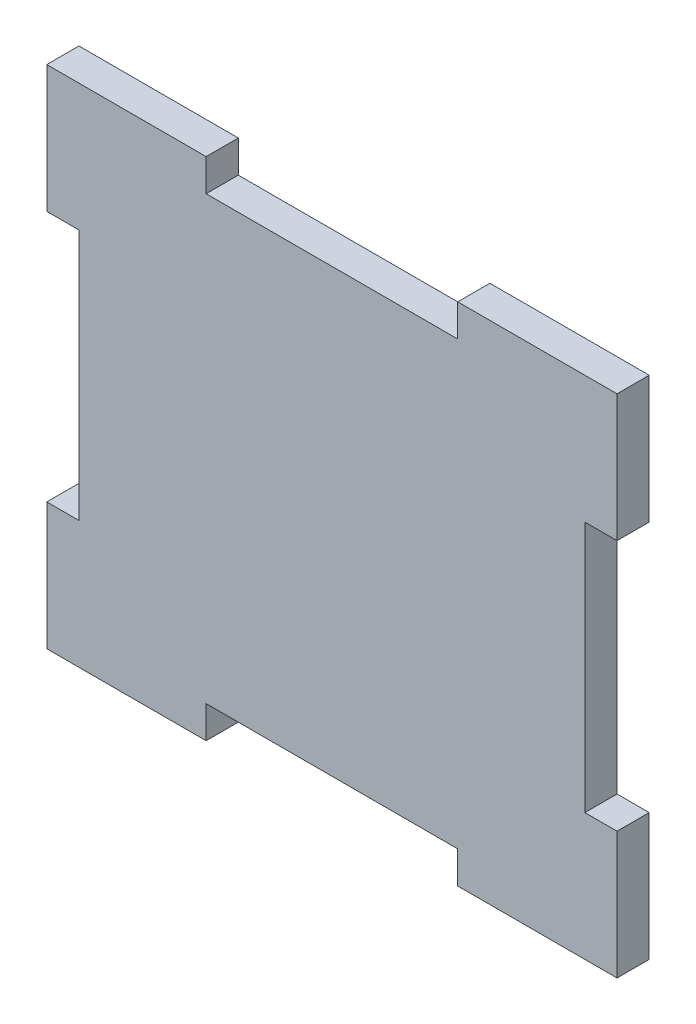
ISO-10303-21;
HEADER;
FILE_DESCRIPTION(('STEP AP214'),'2;1');
FILE_NAME('part.step','',(''),(''),'','','');
FILE_SCHEMA(('AUTOMOTIVE_DESIGN { 1 0 10303 214 1 1 1 1 }'));
ENDSEC;
DATA;
#1=APPLICATION_CONTEXT('core data for automotive mechanical design processes');
#2=APPLICATION_PROTOCOL_DEFINITION('international standard','automotive_design',2000,#1);
#3=PRODUCT_CONTEXT('',#1,'mechanical');
#4=PRODUCT('Part','Part','',(#3));
#5=PRODUCT_RELATED_PRODUCT_CATEGORY('part','',(#4));
#6=PRODUCT_DEFINITION_FORMATION('','',#4);
#7=PRODUCT_DEFINITION_CONTEXT('part definition',#1,'design');
#8=PRODUCT_DEFINITION('design','',#6,#7);
#9=PRODUCT_DEFINITION_SHAPE('','',#8);
#10=(LENGTH_UNIT() NAMED_UNIT(*) SI_UNIT(.MILLI.,.METRE.));
#11=(NAMED_UNIT(*) PLANE_ANGLE_UNIT() SI_UNIT($,.RADIAN.));
#12=(NAMED_UNIT(*) SI_UNIT($,.STERADIAN.) SOLID_ANGLE_UNIT());
#13=UNCERTAINTY_MEASURE_WITH_UNIT(LENGTH_MEASURE(1.E-05),#10,'distance_accuracy_value','');
#14=(GEOMETRIC_REPRESENTATION_CONTEXT(3) GLOBAL_UNCERTAINTY_ASSIGNED_CONTEXT((#13)) GLOBAL_UNIT_ASSIGNED_CONTEXT((#10,
#11,#12)) REPRESENTATION_CONTEXT('',''));
#15=CARTESIAN_POINT('',(0.,0.,0.));
#16=DIRECTION('',(0.,0.,1.));
#17=DIRECTION('',(1.,0.,0.));
#18=AXIS2_PLACEMENT_3D('',#15,#16,#17);
#19=CARTESIAN_POINT('',(0.,0.,6.36));
#20=DIRECTION('',(0.,0.,1.));
#21=DIRECTION('',(1.,0.,0.));
#22=AXIS2_PLACEMENT_3D('',#19,#20,#21);
#23=PLANE('',#22);
#24=DIRECTION('',(0.,-1.,0.));
#25=VECTOR('',#24,1.);
#26=CARTESIAN_POINT('',(-56.36,50.,6.36));
#27=LINE('',#26,#25);
#28=CARTESIAN_POINT('',(-56.36,50.,6.36));
#29=VERTEX_POINT('',#28);
#30=CARTESIAN_POINT('',(-56.36,24.865,6.36));
#31=VERTEX_POINT('',#30);
#32=EDGE_CURVE('E296',#29,#31,#27,.T.);
#33=ORIENTED_EDGE('',*,*,#32,.T.);
#34=DIRECTION('',(1.,0.,0.));
#35=VECTOR('',#34,1.);
#36=CARTESIAN_POINT('',(-56.36,24.865,6.36));
#37=LINE('',#36,#35);
#38=CARTESIAN_POINT('',(-50.,24.865,6.36));
#39=VERTEX_POINT('',#38);
#40=EDGE_CURVE('E196',#31,#39,#37,.T.);
#41=ORIENTED_EDGE('',*,*,#40,.T.);
#42=DIRECTION('',(0.,-1.,0.));
#43=VECTOR('',#42,1.);
#44=CARTESIAN_POINT('',(-50.,24.865,6.36));
#45=LINE('',#44,#43);
#46=CARTESIAN_POINT('',(-50.,-24.865,6.36));
#47=VERTEX_POINT('',#46);
#48=EDGE_CURVE('E199',#39,#47,#45,.T.);
#49=ORIENTED_EDGE('',*,*,#48,.T.);
#50=DIRECTION('',(-1.,0.,0.));
#51=VECTOR('',#50,1.);
#52=CARTESIAN_POINT('',(-56.36,-24.865,6.36));
#53=LINE('',#52,#51);
#54=CARTESIAN_POINT('',(-56.36,-24.865,6.36));
#55=VERTEX_POINT('',#54);
#56=EDGE_CURVE('E188',#47,#55,#53,.T.);
#57=ORIENTED_EDGE('',*,*,#56,.T.);
#58=CARTESIAN_POINT('',(-56.36,-50.,6.36));
#59=VERTEX_POINT('',#58);
#60=EDGE_CURVE('E295',#55,#59,#27,.T.);
#61=ORIENTED_EDGE('',*,*,#60,.T.);
#62=DIRECTION('',(1.,0.,0.));
#63=VECTOR('',#62,1.);
#64=CARTESIAN_POINT('',(-56.36,-50.,6.36));
#65=LINE('',#64,#63);
#66=CARTESIAN_POINT('',(-24.865,-50.,6.36));
#67=VERTEX_POINT('',#66);
#68=EDGE_CURVE('E300',#59,#67,#65,.T.);
#69=ORIENTED_EDGE('',*,*,#68,.T.);
#70=DIRECTION('',(0.,1.,0.));
#71=VECTOR('',#70,1.);
#72=CARTESIAN_POINT('',(-24.865,-50.,6.36));
#73=LINE('',#72,#71);
#74=CARTESIAN_POINT('',(-24.865,-43.64,6.36));
#75=VERTEX_POINT('',#74);
#76=EDGE_CURVE('E229',#67,#75,#73,.T.);
#77=ORIENTED_EDGE('',*,*,#76,.T.);
#78=DIRECTION('',(1.,0.,0.));
#79=VECTOR('',#78,1.);
#80=CARTESIAN_POINT('',(-24.865,-43.64,6.36));
#81=LINE('',#80,#79);
#82=CARTESIAN_POINT('',(24.865,-43.64,6.36));
#83=VERTEX_POINT('',#82);
#84=EDGE_CURVE('E238',#75,#83,#81,.T.);
#85=ORIENTED_EDGE('',*,*,#84,.T.);
#86=DIRECTION('',(0.,-1.,0.));
#87=VECTOR('',#86,1.);
#88=CARTESIAN_POINT('',(24.865,-50.,6.36));
#89=LINE('',#88,#87);
#90=CARTESIAN_POINT('',(24.865,-50.,6.36));
#91=VERTEX_POINT('',#90);
#92=EDGE_CURVE('E246',#83,#91,#89,.T.);
#93=ORIENTED_EDGE('',*,*,#92,.T.);
#94=CARTESIAN_POINT('',(56.36,-50.,6.36));
#95=VERTEX_POINT('',#94);
#96=EDGE_CURVE('E299',#91,#95,#65,.T.);
#97=ORIENTED_EDGE('',*,*,#96,.T.);
#98=DIRECTION('',(0.,1.,0.));
#99=VECTOR('',#98,1.);
#100=CARTESIAN_POINT('',(56.36,50.,6.36));
#101=LINE('',#100,#99);
#102=CARTESIAN_POINT('',(56.36,-24.865,6.36));
#103=VERTEX_POINT('',#102);
#104=EDGE_CURVE('E287',#95,#103,#101,.T.);
#105=ORIENTED_EDGE('',*,*,#104,.T.);
#106=DIRECTION('',(1.,0.,0.));
#107=VECTOR('',#106,1.);
#108=CARTESIAN_POINT('',(56.36,-24.865,6.36));
#109=LINE('',#108,#107);
#110=CARTESIAN_POINT('',(50.,-24.865,6.36));
#111=VERTEX_POINT('',#110);
#112=EDGE_CURVE('E213',#111,#103,#109,.T.);
#113=ORIENTED_EDGE('',*,*,#112,.F.);
#114=DIRECTION('',(0.,-1.,0.));
#115=VECTOR('',#114,1.);
#116=CARTESIAN_POINT('',(50.,24.865,6.36));
#117=LINE('',#116,#115);
#118=CARTESIAN_POINT('',(50.,24.865,6.36));
#119=VERTEX_POINT('',#118);
#120=EDGE_CURVE('E222',#119,#111,#117,.T.);
#121=ORIENTED_EDGE('',*,*,#120,.F.);
#122=DIRECTION('',(-1.,0.,0.));
#123=VECTOR('',#122,1.);
#124=CARTESIAN_POINT('',(56.36,24.865,6.36));
#125=LINE('',#124,#123);
#126=CARTESIAN_POINT('',(56.36,24.865,6.36));
#127=VERTEX_POINT('',#126);
#128=EDGE_CURVE('E208',#127,#119,#125,.T.);
#129=ORIENTED_EDGE('',*,*,#128,.F.);
#130=CARTESIAN_POINT('',(56.36,50.,6.36));
#131=VERTEX_POINT('',#130);
#132=EDGE_CURVE('E291',#127,#131,#101,.T.);
#133=ORIENTED_EDGE('',*,*,#132,.T.);
#134=DIRECTION('',(-1.,0.,0.));
#135=VECTOR('',#134,1.);
#136=CARTESIAN_POINT('',(-56.36,50.,6.36));
#137=LINE('',#136,#135);
#138=CARTESIAN_POINT('',(24.865,50.,6.36));
#139=VERTEX_POINT('',#138);
#140=EDGE_CURVE('E292',#131,#139,#137,.T.);
#141=ORIENTED_EDGE('',*,*,#140,.T.);
#142=DIRECTION('',(0.,1.,0.));
#143=VECTOR('',#142,1.);
#144=CARTESIAN_POINT('',(24.865,50.,6.36));
#145=LINE('',#144,#143);
#146=CARTESIAN_POINT('',(24.865,43.64,6.36));
#147=VERTEX_POINT('',#146);
#148=EDGE_CURVE('E265',#147,#139,#145,.T.);
#149=ORIENTED_EDGE('',*,*,#148,.F.);
#150=DIRECTION('',(1.,0.,0.));
#151=VECTOR('',#150,1.);
#152=CARTESIAN_POINT('',(-24.865,43.64,6.36));
#153=LINE('',#152,#151);
#154=CARTESIAN_POINT('',(-24.865,43.64,6.36));
#155=VERTEX_POINT('',#154);
#156=EDGE_CURVE('E274',#155,#147,#153,.T.);
#157=ORIENTED_EDGE('',*,*,#156,.F.);
#158=DIRECTION('',(0.,-1.,0.));
#159=VECTOR('',#158,1.);
#160=CARTESIAN_POINT('',(-24.865,50.,6.36));
#161=LINE('',#160,#159);
#162=CARTESIAN_POINT('',(-24.865,50.,6.36));
#163=VERTEX_POINT('',#162);
#164=EDGE_CURVE('E254',#163,#155,#161,.T.);
#165=ORIENTED_EDGE('',*,*,#164,.F.);
#166=EDGE_CURVE('E290',#163,#29,#137,.T.);
#167=ORIENTED_EDGE('',*,*,#166,.T.);
#168=EDGE_LOOP('',(#33,#41,#49,#57,#61,#69,#77,#85,#93,#97,#105,#113,#121,#129,#133,#141,#149,
#157,#165,#167));
#169=FACE_BOUND('',#168,.T.);
#170=ADVANCED_FACE('F38',(#169),#23,.T.);
#171=CARTESIAN_POINT('',(0.,0.,0.));
#172=DIRECTION('',(0.,0.,1.));
#173=DIRECTION('',(1.,0.,0.));
#174=AXIS2_PLACEMENT_3D('',#171,#172,#173);
#175=PLANE('',#174);
#176=DIRECTION('',(1.,0.,0.));
#177=VECTOR('',#176,1.);
#178=CARTESIAN_POINT('',(-56.36,24.865,0.));
#179=LINE('',#178,#177);
#180=CARTESIAN_POINT('',(-56.36,24.865,0.));
#181=VERTEX_POINT('',#180);
#182=CARTESIAN_POINT('',(-50.,24.865,0.));
#183=VERTEX_POINT('',#182);
#184=EDGE_CURVE('E184',#181,#183,#179,.T.);
#185=ORIENTED_EDGE('',*,*,#184,.F.);
#186=DIRECTION('',(0.,-1.,0.));
#187=VECTOR('',#186,1.);
#188=CARTESIAN_POINT('',(-56.36,50.,0.));
#189=LINE('',#188,#187);
#190=CARTESIAN_POINT('',(-56.36,50.,0.));
#191=VERTEX_POINT('',#190);
#192=EDGE_CURVE('E311',#191,#181,#189,.T.);
#193=ORIENTED_EDGE('',*,*,#192,.F.);
#194=DIRECTION('',(-1.,0.,0.));
#195=VECTOR('',#194,1.);
#196=CARTESIAN_POINT('',(-56.36,50.,0.));
#197=LINE('',#196,#195);
#198=CARTESIAN_POINT('',(-24.865,50.,0.));
#199=VERTEX_POINT('',#198);
#200=EDGE_CURVE('E307',#199,#191,#197,.T.);
#201=ORIENTED_EDGE('',*,*,#200,.F.);
#202=DIRECTION('',(0.,-1.,0.));
#203=VECTOR('',#202,1.);
#204=CARTESIAN_POINT('',(-24.865,50.,0.));
#205=LINE('',#204,#203);
#206=CARTESIAN_POINT('',(-24.865,43.64,0.));
#207=VERTEX_POINT('',#206);
#208=EDGE_CURVE('E261',#199,#207,#205,.T.);
#209=ORIENTED_EDGE('',*,*,#208,.T.);
#210=DIRECTION('',(1.,0.,0.));
#211=VECTOR('',#210,1.);
#212=CARTESIAN_POINT('',(-24.865,43.64,0.));
#213=LINE('',#212,#211);
#214=CARTESIAN_POINT('',(24.865,43.64,0.));
#215=VERTEX_POINT('',#214);
#216=EDGE_CURVE('E264',#207,#215,#213,.T.);
#217=ORIENTED_EDGE('',*,*,#216,.T.);
#218=DIRECTION('',(0.,1.,0.));
#219=VECTOR('',#218,1.);
#220=CARTESIAN_POINT('',(24.865,50.,0.));
#221=LINE('',#220,#219);
#222=CARTESIAN_POINT('',(24.865,50.,0.));
#223=VERTEX_POINT('',#222);
#224=EDGE_CURVE('E268',#215,#223,#221,.T.);
#225=ORIENTED_EDGE('',*,*,#224,.T.);
#226=CARTESIAN_POINT('',(56.36,50.,0.));
#227=VERTEX_POINT('',#226);
#228=EDGE_CURVE('E308',#227,#223,#197,.T.);
#229=ORIENTED_EDGE('',*,*,#228,.F.);
#230=DIRECTION('',(0.,1.,0.));
#231=VECTOR('',#230,1.);
#232=CARTESIAN_POINT('',(56.36,50.,0.));
#233=LINE('',#232,#231);
#234=CARTESIAN_POINT('',(56.36,24.865,0.));
#235=VERTEX_POINT('',#234);
#236=EDGE_CURVE('E280',#235,#227,#233,.T.);
#237=ORIENTED_EDGE('',*,*,#236,.F.);
#238=DIRECTION('',(-1.,0.,0.));
#239=VECTOR('',#238,1.);
#240=CARTESIAN_POINT('',(56.36,24.865,0.));
#241=LINE('',#240,#239);
#242=CARTESIAN_POINT('',(50.,24.865,0.));
#243=VERTEX_POINT('',#242);
#244=EDGE_CURVE('E61',#235,#243,#241,.T.);
#245=ORIENTED_EDGE('',*,*,#244,.T.);
#246=DIRECTION('',(0.,-1.,0.));
#247=VECTOR('',#246,1.);
#248=CARTESIAN_POINT('',(50.,24.865,0.));
#249=LINE('',#248,#247);
#250=CARTESIAN_POINT('',(50.,-24.865,0.));
#251=VERTEX_POINT('',#250);
#252=EDGE_CURVE('E212',#243,#251,#249,.T.);
#253=ORIENTED_EDGE('',*,*,#252,.T.);
#254=DIRECTION('',(1.,0.,0.));
#255=VECTOR('',#254,1.);
#256=CARTESIAN_POINT('',(56.36,-24.865,0.));
#257=LINE('',#256,#255);
#258=CARTESIAN_POINT('',(56.36,-24.865,0.));
#259=VERTEX_POINT('',#258);
#260=EDGE_CURVE('E216',#251,#259,#257,.T.);
#261=ORIENTED_EDGE('',*,*,#260,.T.);
#262=CARTESIAN_POINT('',(56.36,-50.,0.));
#263=VERTEX_POINT('',#262);
#264=EDGE_CURVE('E304',#263,#259,#233,.T.);
#265=ORIENTED_EDGE('',*,*,#264,.F.);
#266=DIRECTION('',(1.,0.,0.));
#267=VECTOR('',#266,1.);
#268=CARTESIAN_POINT('',(-56.36,-50.,0.));
#269=LINE('',#268,#267);
#270=CARTESIAN_POINT('',(24.865,-50.,0.));
#271=VERTEX_POINT('',#270);
#272=EDGE_CURVE('E314',#271,#263,#269,.T.);
#273=ORIENTED_EDGE('',*,*,#272,.F.);
#274=DIRECTION('',(0.,-1.,0.));
#275=VECTOR('',#274,1.);
#276=CARTESIAN_POINT('',(24.865,-50.,0.));
#277=LINE('',#276,#275);
#278=CARTESIAN_POINT('',(24.865,-43.64,0.));
#279=VERTEX_POINT('',#278);
#280=EDGE_CURVE('E237',#279,#271,#277,.T.);
#281=ORIENTED_EDGE('',*,*,#280,.F.);
#282=DIRECTION('',(1.,0.,0.));
#283=VECTOR('',#282,1.);
#284=CARTESIAN_POINT('',(-24.865,-43.64,0.));
#285=LINE('',#284,#283);
#286=CARTESIAN_POINT('',(-24.865,-43.64,0.));
#287=VERTEX_POINT('',#286);
#288=EDGE_CURVE('E240',#287,#279,#285,.T.);
#289=ORIENTED_EDGE('',*,*,#288,.F.);
#290=DIRECTION('',(0.,1.,0.));
#291=VECTOR('',#290,1.);
#292=CARTESIAN_POINT('',(-24.865,-50.,0.));
#293=LINE('',#292,#291);
#294=CARTESIAN_POINT('',(-24.865,-50.,0.));
#295=VERTEX_POINT('',#294);
#296=EDGE_CURVE('E235',#295,#287,#293,.T.);
#297=ORIENTED_EDGE('',*,*,#296,.F.);
#298=CARTESIAN_POINT('',(-56.36,-50.,0.));
#299=VERTEX_POINT('',#298);
#300=EDGE_CURVE('E315',#299,#295,#269,.T.);
#301=ORIENTED_EDGE('',*,*,#300,.F.);
#302=CARTESIAN_POINT('',(-56.36,-24.865,0.));
#303=VERTEX_POINT('',#302);
#304=EDGE_CURVE('E195',#303,#299,#189,.T.);
#305=ORIENTED_EDGE('',*,*,#304,.F.);
#306=DIRECTION('',(-1.,0.,0.));
#307=VECTOR('',#306,1.);
#308=CARTESIAN_POINT('',(-56.36,-24.865,0.));
#309=LINE('',#308,#307);
#310=CARTESIAN_POINT('',(-50.,-24.865,0.));
#311=VERTEX_POINT('',#310);
#312=EDGE_CURVE('E53',#311,#303,#309,.T.);
#313=ORIENTED_EDGE('',*,*,#312,.F.);
#314=DIRECTION('',(0.,-1.,0.));
#315=VECTOR('',#314,1.);
#316=CARTESIAN_POINT('',(-50.,24.865,0.));
#317=LINE('',#316,#315);
#318=EDGE_CURVE('E176',#183,#311,#317,.T.);
#319=ORIENTED_EDGE('',*,*,#318,.F.);
#320=EDGE_LOOP('',(#185,#193,#201,#209,#217,#225,#229,#237,#245,#253,#261,#265,#273,#281,#289,
#297,#301,#305,#313,#319));
#321=FACE_BOUND('',#320,.T.);
#322=ADVANCED_FACE('F193',(#321),#175,.F.);
#323=CARTESIAN_POINT('',(-56.36,50.,6.36));
#324=DIRECTION('',(1.,0.,0.));
#325=DIRECTION('',(0.,1.,0.));
#326=AXIS2_PLACEMENT_3D('',#323,#324,#325);
#327=PLANE('',#326);
#328=DIRECTION('',(0.,0.,1.));
#329=VECTOR('',#328,1.);
#330=CARTESIAN_POINT('',(-56.36,24.865,0.));
#331=LINE('',#330,#329);
#332=EDGE_CURVE('E205',#181,#31,#331,.T.);
#333=ORIENTED_EDGE('',*,*,#332,.T.);
#334=ORIENTED_EDGE('',*,*,#32,.F.);
#335=DIRECTION('',(0.,0.,-1.));
#336=VECTOR('',#335,1.);
#337=CARTESIAN_POINT('',(-56.36,50.,6.36));
#338=LINE('',#337,#336);
#339=EDGE_CURVE('E46',#29,#191,#338,.T.);
#340=ORIENTED_EDGE('',*,*,#339,.T.);
#341=ORIENTED_EDGE('',*,*,#192,.T.);
#342=EDGE_LOOP('',(#333,#334,#340,#341));
#343=FACE_BOUND('',#342,.T.);
#344=ADVANCED_FACE('F327',(#343),#327,.F.);
#345=DIRECTION('',(0.,0.,1.));
#346=VECTOR('',#345,1.);
#347=CARTESIAN_POINT('',(-56.36,-24.865,0.));
#348=LINE('',#347,#346);
#349=EDGE_CURVE('E190',#303,#55,#348,.T.);
#350=ORIENTED_EDGE('',*,*,#349,.F.);
#351=ORIENTED_EDGE('',*,*,#304,.T.);
#352=DIRECTION('',(0.,0.,-1.));
#353=VECTOR('',#352,1.);
#354=CARTESIAN_POINT('',(-56.36,-50.,6.36));
#355=LINE('',#354,#353);
#356=EDGE_CURVE('E320',#59,#299,#355,.T.);
#357=ORIENTED_EDGE('',*,*,#356,.F.);
#358=ORIENTED_EDGE('',*,*,#60,.F.);
#359=EDGE_LOOP('',(#350,#351,#357,#358));
#360=FACE_BOUND('',#359,.T.);
#361=ADVANCED_FACE('F391',(#360),#327,.F.);
#362=CARTESIAN_POINT('',(56.36,50.,6.36));
#363=DIRECTION('',(-1.,0.,0.));
#364=DIRECTION('',(0.,-1.,0.));
#365=AXIS2_PLACEMENT_3D('',#362,#363,#364);
#366=PLANE('',#365);
#367=ORIENTED_EDGE('',*,*,#264,.T.);
#368=DIRECTION('',(0.,0.,1.));
#369=VECTOR('',#368,1.);
#370=CARTESIAN_POINT('',(56.36,-24.865,0.));
#371=LINE('',#370,#369);
#372=EDGE_CURVE('E226',#259,#103,#371,.T.);
#373=ORIENTED_EDGE('',*,*,#372,.T.);
#374=ORIENTED_EDGE('',*,*,#104,.F.);
#375=DIRECTION('',(0.,0.,-1.));
#376=VECTOR('',#375,1.);
#377=CARTESIAN_POINT('',(56.36,-50.,6.36));
#378=LINE('',#377,#376);
#379=EDGE_CURVE('E303',#95,#263,#378,.T.);
#380=ORIENTED_EDGE('',*,*,#379,.T.);
#381=EDGE_LOOP('',(#367,#373,#374,#380));
#382=FACE_BOUND('',#381,.T.);
#383=ADVANCED_FACE('F367',(#382),#366,.F.);
#384=CARTESIAN_POINT('',(-56.36,-50.,6.36));
#385=DIRECTION('',(0.,1.,0.));
#386=DIRECTION('',(0.,0.,1.));
#387=AXIS2_PLACEMENT_3D('',#384,#385,#386);
#388=PLANE('',#387);
#389=DIRECTION('',(0.,0.,1.));
#390=VECTOR('',#389,1.);
#391=CARTESIAN_POINT('',(-24.865,-50.,0.));
#392=LINE('',#391,#390);
#393=EDGE_CURVE('E243',#295,#67,#392,.T.);
#394=ORIENTED_EDGE('',*,*,#393,.T.);
#395=ORIENTED_EDGE('',*,*,#68,.F.);
#396=ORIENTED_EDGE('',*,*,#356,.T.);
#397=ORIENTED_EDGE('',*,*,#300,.T.);
#398=EDGE_LOOP('',(#394,#395,#396,#397));
#399=FACE_BOUND('',#398,.T.);
#400=ADVANCED_FACE('F389',(#399),#388,.F.);
#401=DIRECTION('',(0.,0.,1.));
#402=VECTOR('',#401,1.);
#403=CARTESIAN_POINT('',(24.865,-50.,0.));
#404=LINE('',#403,#402);
#405=EDGE_CURVE('E257',#271,#91,#404,.T.);
#406=ORIENTED_EDGE('',*,*,#405,.F.);
#407=ORIENTED_EDGE('',*,*,#272,.T.);
#408=ORIENTED_EDGE('',*,*,#379,.F.);
#409=ORIENTED_EDGE('',*,*,#96,.F.);
#410=EDGE_LOOP('',(#406,#407,#408,#409));
#411=FACE_BOUND('',#410,.T.);
#412=ADVANCED_FACE('F373',(#411),#388,.F.);
#413=CARTESIAN_POINT('',(-56.36,50.,6.36));
#414=DIRECTION('',(0.,-1.,0.));
#415=DIRECTION('',(0.,0.,-1.));
#416=AXIS2_PLACEMENT_3D('',#413,#414,#415);
#417=PLANE('',#416);
#418=ORIENTED_EDGE('',*,*,#166,.F.);
#419=DIRECTION('',(0.,0.,1.));
#420=VECTOR('',#419,1.);
#421=CARTESIAN_POINT('',(-24.865,50.,0.));
#422=LINE('',#421,#420);
#423=EDGE_CURVE('E278',#199,#163,#422,.T.);
#424=ORIENTED_EDGE('',*,*,#423,.F.);
#425=ORIENTED_EDGE('',*,*,#200,.T.);
#426=ORIENTED_EDGE('',*,*,#339,.F.);
#427=EDGE_LOOP('',(#418,#424,#425,#426));
#428=FACE_BOUND('',#427,.T.);
#429=ADVANCED_FACE('F337',(#428),#417,.F.);
#430=ORIENTED_EDGE('',*,*,#132,.F.);
#431=DIRECTION('',(0.,0.,1.));
#432=VECTOR('',#431,1.);
#433=CARTESIAN_POINT('',(56.36,24.865,0.));
#434=LINE('',#433,#432);
#435=EDGE_CURVE('E219',#235,#127,#434,.T.);
#436=ORIENTED_EDGE('',*,*,#435,.F.);
#437=ORIENTED_EDGE('',*,*,#236,.T.);
#438=DIRECTION('',(0.,0.,-1.));
#439=VECTOR('',#438,1.);
#440=CARTESIAN_POINT('',(56.36,50.,6.36));
#441=LINE('',#440,#439);
#442=EDGE_CURVE('E11',#131,#227,#441,.T.);
#443=ORIENTED_EDGE('',*,*,#442,.F.);
#444=EDGE_LOOP('',(#430,#436,#437,#443));
#445=FACE_BOUND('',#444,.T.);
#446=ADVANCED_FACE('F40',(#445),#366,.F.);
#447=ORIENTED_EDGE('',*,*,#228,.T.);
#448=DIRECTION('',(0.,0.,1.));
#449=VECTOR('',#448,1.);
#450=CARTESIAN_POINT('',(24.865,50.,0.));
#451=LINE('',#450,#449);
#452=EDGE_CURVE('E281',#223,#139,#451,.T.);
#453=ORIENTED_EDGE('',*,*,#452,.T.);
#454=ORIENTED_EDGE('',*,*,#140,.F.);
#455=ORIENTED_EDGE('',*,*,#442,.T.);
#456=EDGE_LOOP('',(#447,#453,#454,#455));
#457=FACE_BOUND('',#456,.T.);
#458=ADVANCED_FACE('F350',(#457),#417,.F.);
#459=CARTESIAN_POINT('',(-24.865,50.,0.));
#460=DIRECTION('',(-1.,0.,0.));
#461=DIRECTION('',(0.,0.,1.));
#462=AXIS2_PLACEMENT_3D('',#459,#460,#461);
#463=PLANE('',#462);
#464=ORIENTED_EDGE('',*,*,#164,.T.);
#465=DIRECTION('',(0.,0.,1.));
#466=VECTOR('',#465,1.);
#467=CARTESIAN_POINT('',(-24.865,43.64,0.));
#468=LINE('',#467,#466);
#469=EDGE_CURVE('E271',#207,#155,#468,.T.);
#470=ORIENTED_EDGE('',*,*,#469,.F.);
#471=ORIENTED_EDGE('',*,*,#208,.F.);
#472=ORIENTED_EDGE('',*,*,#423,.T.);
#473=EDGE_LOOP('',(#464,#470,#471,#472));
#474=FACE_BOUND('',#473,.T.);
#475=ADVANCED_FACE('F339',(#474),#463,.F.);
#476=CARTESIAN_POINT('',(24.865,50.,0.));
#477=DIRECTION('',(1.,0.,0.));
#478=DIRECTION('',(0.,0.,-1.));
#479=AXIS2_PLACEMENT_3D('',#476,#477,#478);
#480=PLANE('',#479);
#481=ORIENTED_EDGE('',*,*,#148,.T.);
#482=ORIENTED_EDGE('',*,*,#452,.F.);
#483=ORIENTED_EDGE('',*,*,#224,.F.);
#484=DIRECTION('',(0.,0.,1.));
#485=VECTOR('',#484,1.);
#486=CARTESIAN_POINT('',(24.865,43.64,0.));
#487=LINE('',#486,#485);
#488=EDGE_CURVE('E284',#215,#147,#487,.T.);
#489=ORIENTED_EDGE('',*,*,#488,.T.);
#490=EDGE_LOOP('',(#481,#482,#483,#489));
#491=FACE_BOUND('',#490,.T.);
#492=ADVANCED_FACE('F347',(#491),#480,.F.);
#493=CARTESIAN_POINT('',(-24.865,43.64,0.));
#494=DIRECTION('',(0.,-1.,0.));
#495=DIRECTION('',(1.,0.,0.));
#496=AXIS2_PLACEMENT_3D('',#493,#494,#495);
#497=PLANE('',#496);
#498=ORIENTED_EDGE('',*,*,#156,.T.);
#499=ORIENTED_EDGE('',*,*,#488,.F.);
#500=ORIENTED_EDGE('',*,*,#216,.F.);
#501=ORIENTED_EDGE('',*,*,#469,.T.);
#502=EDGE_LOOP('',(#498,#499,#500,#501));
#503=FACE_BOUND('',#502,.T.);
#504=ADVANCED_FACE('F344',(#503),#497,.F.);
#505=CARTESIAN_POINT('',(-24.865,-50.,0.));
#506=DIRECTION('',(1.,0.,0.));
#507=DIRECTION('',(0.,0.,-1.));
#508=AXIS2_PLACEMENT_3D('',#505,#506,#507);
#509=PLANE('',#508);
#510=ORIENTED_EDGE('',*,*,#76,.F.);
#511=ORIENTED_EDGE('',*,*,#393,.F.);
#512=ORIENTED_EDGE('',*,*,#296,.T.);
#513=DIRECTION('',(0.,0.,1.));
#514=VECTOR('',#513,1.);
#515=CARTESIAN_POINT('',(-24.865,-43.64,0.));
#516=LINE('',#515,#514);
#517=EDGE_CURVE('E251',#287,#75,#516,.T.);
#518=ORIENTED_EDGE('',*,*,#517,.T.);
#519=EDGE_LOOP('',(#510,#511,#512,#518));
#520=FACE_BOUND('',#519,.T.);
#521=ADVANCED_FACE('F384',(#520),#509,.T.);
#522=CARTESIAN_POINT('',(-24.865,-43.64,0.));
#523=DIRECTION('',(0.,-1.,0.));
#524=DIRECTION('',(1.,0.,0.));
#525=AXIS2_PLACEMENT_3D('',#522,#523,#524);
#526=PLANE('',#525);
#527=ORIENTED_EDGE('',*,*,#84,.F.);
#528=ORIENTED_EDGE('',*,*,#517,.F.);
#529=ORIENTED_EDGE('',*,*,#288,.T.);
#530=DIRECTION('',(0.,0.,1.));
#531=VECTOR('',#530,1.);
#532=CARTESIAN_POINT('',(24.865,-43.64,0.));
#533=LINE('',#532,#531);
#534=EDGE_CURVE('E255',#279,#83,#533,.T.);
#535=ORIENTED_EDGE('',*,*,#534,.T.);
#536=EDGE_LOOP('',(#527,#528,#529,#535));
#537=FACE_BOUND('',#536,.T.);
#538=ADVANCED_FACE('F382',(#537),#526,.T.);
#539=CARTESIAN_POINT('',(24.865,-50.,0.));
#540=DIRECTION('',(-1.,0.,0.));
#541=DIRECTION('',(0.,0.,1.));
#542=AXIS2_PLACEMENT_3D('',#539,#540,#541);
#543=PLANE('',#542);
#544=ORIENTED_EDGE('',*,*,#92,.F.);
#545=ORIENTED_EDGE('',*,*,#534,.F.);
#546=ORIENTED_EDGE('',*,*,#280,.T.);
#547=ORIENTED_EDGE('',*,*,#405,.T.);
#548=EDGE_LOOP('',(#544,#545,#546,#547));
#549=FACE_BOUND('',#548,.T.);
#550=ADVANCED_FACE('F379',(#549),#543,.T.);
#551=CARTESIAN_POINT('',(56.36,-24.865,0.));
#552=DIRECTION('',(0.,-1.,0.));
#553=DIRECTION('',(0.,0.,-1.));
#554=AXIS2_PLACEMENT_3D('',#551,#552,#553);
#555=PLANE('',#554);
#556=ORIENTED_EDGE('',*,*,#112,.T.);
#557=ORIENTED_EDGE('',*,*,#372,.F.);
#558=ORIENTED_EDGE('',*,*,#260,.F.);
#559=DIRECTION('',(0.,0.,1.));
#560=VECTOR('',#559,1.);
#561=CARTESIAN_POINT('',(50.,-24.865,0.));
#562=LINE('',#561,#560);
#563=EDGE_CURVE('E230',#251,#111,#562,.T.);
#564=ORIENTED_EDGE('',*,*,#563,.T.);
#565=EDGE_LOOP('',(#556,#557,#558,#564));
#566=FACE_BOUND('',#565,.T.);
#567=ADVANCED_FACE('F364',(#566),#555,.F.);
#568=CARTESIAN_POINT('',(50.,24.865,0.));
#569=DIRECTION('',(-1.,0.,0.));
#570=DIRECTION('',(0.,-1.,0.));
#571=AXIS2_PLACEMENT_3D('',#568,#569,#570);
#572=PLANE('',#571);
#573=ORIENTED_EDGE('',*,*,#120,.T.);
#574=ORIENTED_EDGE('',*,*,#563,.F.);
#575=ORIENTED_EDGE('',*,*,#252,.F.);
#576=DIRECTION('',(0.,0.,1.));
#577=VECTOR('',#576,1.);
#578=CARTESIAN_POINT('',(50.,24.865,0.));
#579=LINE('',#578,#577);
#580=EDGE_CURVE('E232',#243,#119,#579,.T.);
#581=ORIENTED_EDGE('',*,*,#580,.T.);
#582=EDGE_LOOP('',(#573,#574,#575,#581));
#583=FACE_BOUND('',#582,.T.);
#584=ADVANCED_FACE('F361',(#583),#572,.F.);
#585=CARTESIAN_POINT('',(56.36,24.865,0.));
#586=DIRECTION('',(0.,1.,0.));
#587=DIRECTION('',(0.,0.,1.));
#588=AXIS2_PLACEMENT_3D('',#585,#586,#587);
#589=PLANE('',#588);
#590=ORIENTED_EDGE('',*,*,#128,.T.);
#591=ORIENTED_EDGE('',*,*,#580,.F.);
#592=ORIENTED_EDGE('',*,*,#244,.F.);
#593=ORIENTED_EDGE('',*,*,#435,.T.);
#594=EDGE_LOOP('',(#590,#591,#592,#593));
#595=FACE_BOUND('',#594,.T.);
#596=ADVANCED_FACE('F435',(#595),#589,.F.);
#597=CARTESIAN_POINT('',(-56.36,24.865,0.));
#598=DIRECTION('',(0.,-1.,0.));
#599=DIRECTION('',(0.,0.,-1.));
#600=AXIS2_PLACEMENT_3D('',#597,#598,#599);
#601=PLANE('',#600);
#602=ORIENTED_EDGE('',*,*,#40,.F.);
#603=ORIENTED_EDGE('',*,*,#332,.F.);
#604=ORIENTED_EDGE('',*,*,#184,.T.);
#605=DIRECTION('',(0.,0.,1.));
#606=VECTOR('',#605,1.);
#607=CARTESIAN_POINT('',(-50.,24.865,0.));
#608=LINE('',#607,#606);
#609=EDGE_CURVE('E181',#183,#39,#608,.T.);
#610=ORIENTED_EDGE('',*,*,#609,.T.);
#611=EDGE_LOOP('',(#602,#603,#604,#610));
#612=FACE_BOUND('',#611,.T.);
#613=ADVANCED_FACE('F332',(#612),#601,.T.);
#614=CARTESIAN_POINT('',(-50.,24.865,0.));
#615=DIRECTION('',(-1.,0.,0.));
#616=DIRECTION('',(0.,-1.,0.));
#617=AXIS2_PLACEMENT_3D('',#614,#615,#616);
#618=PLANE('',#617);
#619=ORIENTED_EDGE('',*,*,#48,.F.);
#620=ORIENTED_EDGE('',*,*,#609,.F.);
#621=ORIENTED_EDGE('',*,*,#318,.T.);
#622=DIRECTION('',(0.,0.,1.));
#623=VECTOR('',#622,1.);
#624=CARTESIAN_POINT('',(-50.,-24.865,0.));
#625=LINE('',#624,#623);
#626=EDGE_CURVE('E179',#311,#47,#625,.T.);
#627=ORIENTED_EDGE('',*,*,#626,.T.);
#628=EDGE_LOOP('',(#619,#620,#621,#627));
#629=FACE_BOUND('',#628,.T.);
#630=ADVANCED_FACE('F178',(#629),#618,.T.);
#631=CARTESIAN_POINT('',(-56.36,-24.865,0.));
#632=DIRECTION('',(0.,1.,0.));
#633=DIRECTION('',(0.,0.,1.));
#634=AXIS2_PLACEMENT_3D('',#631,#632,#633);
#635=PLANE('',#634);
#636=ORIENTED_EDGE('',*,*,#56,.F.);
#637=ORIENTED_EDGE('',*,*,#626,.F.);
#638=ORIENTED_EDGE('',*,*,#312,.T.);
#639=ORIENTED_EDGE('',*,*,#349,.T.);
#640=EDGE_LOOP('',(#636,#637,#638,#639));
#641=FACE_BOUND('',#640,.T.);
#642=ADVANCED_FACE('F186',(#641),#635,.T.);
#643=CLOSED_SHELL('',(#170,#322,#344,#361,#383,#400,#412,#429,#446,#458,#475,#492,#504,#521,
#538,#550,#567,#584,#596,#613,#630,#642));
#644=MANIFOLD_SOLID_BREP('B2',#643);
#645=ADVANCED_BREP_SHAPE_REPRESENTATION('',(#18,#644),#14);
#646=SHAPE_DEFINITION_REPRESENTATION(#9,#645);
ENDSEC;
END-ISO-10303-21;
